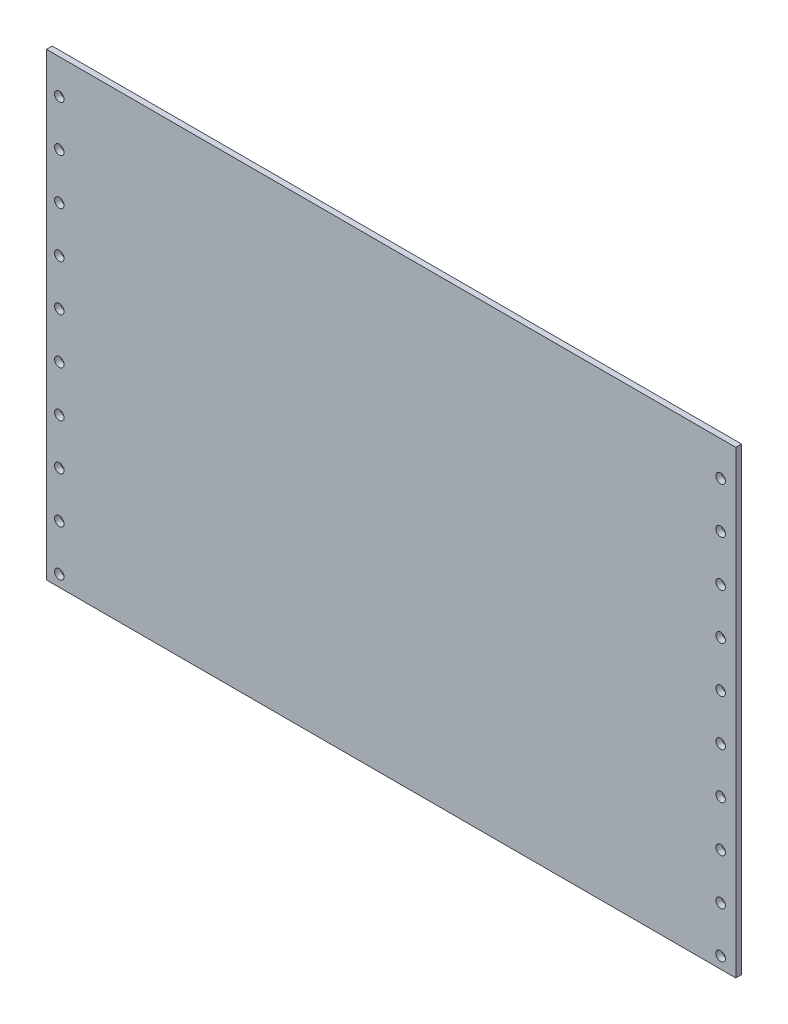
ISO-10303-21;
HEADER;
FILE_DESCRIPTION(('STEP AP214'),'2;1');
FILE_NAME('part.step','',(''),(''),'','','');
FILE_SCHEMA(('AUTOMOTIVE_DESIGN { 1 0 10303 214 1 1 1 1 }'));
ENDSEC;
DATA;
#1=APPLICATION_CONTEXT('core data for automotive mechanical design processes');
#2=APPLICATION_PROTOCOL_DEFINITION('international standard','automotive_design',2000,#1);
#3=PRODUCT_CONTEXT('',#1,'mechanical');
#4=PRODUCT('Part','Part','',(#3));
#5=PRODUCT_RELATED_PRODUCT_CATEGORY('part','',(#4));
#6=PRODUCT_DEFINITION_FORMATION('','',#4);
#7=PRODUCT_DEFINITION_CONTEXT('part definition',#1,'design');
#8=PRODUCT_DEFINITION('design','',#6,#7);
#9=PRODUCT_DEFINITION_SHAPE('','',#8);
#10=(LENGTH_UNIT() NAMED_UNIT(*) SI_UNIT(.MILLI.,.METRE.));
#11=(NAMED_UNIT(*) PLANE_ANGLE_UNIT() SI_UNIT($,.RADIAN.));
#12=(NAMED_UNIT(*) SI_UNIT($,.STERADIAN.) SOLID_ANGLE_UNIT());
#13=UNCERTAINTY_MEASURE_WITH_UNIT(LENGTH_MEASURE(1.E-05),#10,'distance_accuracy_value','');
#14=(GEOMETRIC_REPRESENTATION_CONTEXT(3) GLOBAL_UNCERTAINTY_ASSIGNED_CONTEXT((#13)) GLOBAL_UNIT_ASSIGNED_CONTEXT((#10,
#11,#12)) REPRESENTATION_CONTEXT('',''));
#15=CARTESIAN_POINT('',(0.,0.,0.));
#16=DIRECTION('',(0.,0.,1.));
#17=DIRECTION('',(1.,0.,0.));
#18=AXIS2_PLACEMENT_3D('',#15,#16,#17);
#19=CARTESIAN_POINT('',(0.,0.,3.175));
#20=DIRECTION('',(0.,0.,-1.));
#21=DIRECTION('',(-1.,0.,0.));
#22=AXIS2_PLACEMENT_3D('',#19,#20,#21);
#23=PLANE('',#22);
#24=CARTESIAN_POINT('',(-183.388,107.95,3.175));
#25=DIRECTION('',(0.,0.,1.));
#26=DIRECTION('',(1.,0.,0.));
#27=AXIS2_PLACEMENT_3D('',#24,#25,#26);
#28=CIRCLE('',#27,2.60985);
#29=CARTESIAN_POINT('',(-180.77815,107.95,3.175));
#30=VERTEX_POINT('',#29);
#31=EDGE_CURVE('E232',#30,#30,#28,.T.);
#32=ORIENTED_EDGE('',*,*,#31,.F.);
#33=EDGE_LOOP('',(#32));
#34=FACE_BOUND('',#33,.T.);
#35=CARTESIAN_POINT('',(-183.388,82.55,3.175));
#36=DIRECTION('',(0.,0.,1.));
#37=DIRECTION('',(1.,0.,0.));
#38=AXIS2_PLACEMENT_3D('',#35,#36,#37);
#39=CIRCLE('',#38,2.60985);
#40=CARTESIAN_POINT('',(-180.77815,82.55,3.175));
#41=VERTEX_POINT('',#40);
#42=EDGE_CURVE('E226',#41,#41,#39,.T.);
#43=ORIENTED_EDGE('',*,*,#42,.F.);
#44=EDGE_LOOP('',(#43));
#45=FACE_BOUND('',#44,.T.);
#46=CARTESIAN_POINT('',(-183.387999999999,57.15,3.175));
#47=DIRECTION('',(0.,0.,1.));
#48=DIRECTION('',(1.,0.,0.));
#49=AXIS2_PLACEMENT_3D('',#46,#47,#48);
#50=CIRCLE('',#49,2.60985);
#51=CARTESIAN_POINT('',(-180.778149999999,57.15,3.175));
#52=VERTEX_POINT('',#51);
#53=EDGE_CURVE('E220',#52,#52,#50,.T.);
#54=ORIENTED_EDGE('',*,*,#53,.F.);
#55=EDGE_LOOP('',(#54));
#56=FACE_BOUND('',#55,.T.);
#57=CARTESIAN_POINT('',(-183.387999999999,31.75,3.175));
#58=DIRECTION('',(0.,0.,1.));
#59=DIRECTION('',(1.,0.,0.));
#60=AXIS2_PLACEMENT_3D('',#57,#58,#59);
#61=CIRCLE('',#60,2.60985);
#62=CARTESIAN_POINT('',(-180.778149999999,31.75,3.175));
#63=VERTEX_POINT('',#62);
#64=EDGE_CURVE('E214',#63,#63,#61,.T.);
#65=ORIENTED_EDGE('',*,*,#64,.F.);
#66=EDGE_LOOP('',(#65));
#67=FACE_BOUND('',#66,.T.);
#68=CARTESIAN_POINT('',(-183.387999999999,-19.05,3.175));
#69=DIRECTION('',(0.,0.,1.));
#70=DIRECTION('',(1.,0.,0.));
#71=AXIS2_PLACEMENT_3D('',#68,#69,#70);
#72=CIRCLE('',#71,2.60985);
#73=CARTESIAN_POINT('',(-180.778149999999,-19.05,3.175));
#74=VERTEX_POINT('',#73);
#75=EDGE_CURVE('E202',#74,#74,#72,.T.);
#76=ORIENTED_EDGE('',*,*,#75,.F.);
#77=EDGE_LOOP('',(#76));
#78=FACE_BOUND('',#77,.T.);
#79=CARTESIAN_POINT('',(-183.387999999998,-44.4499999999999,3.175));
#80=DIRECTION('',(0.,0.,1.));
#81=DIRECTION('',(1.,0.,0.));
#82=AXIS2_PLACEMENT_3D('',#79,#80,#81);
#83=CIRCLE('',#82,2.60985);
#84=CARTESIAN_POINT('',(-180.778149999998,-44.4499999999999,3.175));
#85=VERTEX_POINT('',#84);
#86=EDGE_CURVE('E196',#85,#85,#83,.T.);
#87=ORIENTED_EDGE('',*,*,#86,.F.);
#88=EDGE_LOOP('',(#87));
#89=FACE_BOUND('',#88,.T.);
#90=CARTESIAN_POINT('',(-183.387999999998,-69.85,3.175));
#91=DIRECTION('',(0.,0.,1.));
#92=DIRECTION('',(1.,0.,0.));
#93=AXIS2_PLACEMENT_3D('',#90,#91,#92);
#94=CIRCLE('',#93,2.60985);
#95=CARTESIAN_POINT('',(-180.778149999998,-69.85,3.175));
#96=VERTEX_POINT('',#95);
#97=EDGE_CURVE('E190',#96,#96,#94,.T.);
#98=ORIENTED_EDGE('',*,*,#97,.F.);
#99=EDGE_LOOP('',(#98));
#100=FACE_BOUND('',#99,.T.);
#101=CARTESIAN_POINT('',(-183.387999999998,-95.2499999999999,3.175));
#102=DIRECTION('',(0.,0.,1.));
#103=DIRECTION('',(1.,0.,0.));
#104=AXIS2_PLACEMENT_3D('',#101,#102,#103);
#105=CIRCLE('',#104,2.60985);
#106=CARTESIAN_POINT('',(-180.778149999998,-95.2499999999999,3.175));
#107=VERTEX_POINT('',#106);
#108=EDGE_CURVE('E178',#107,#107,#105,.T.);
#109=ORIENTED_EDGE('',*,*,#108,.F.);
#110=EDGE_LOOP('',(#109));
#111=FACE_BOUND('',#110,.T.);
#112=CARTESIAN_POINT('',(182.118000000002,-95.2499999999999,3.175));
#113=DIRECTION('',(0.,0.,1.));
#114=DIRECTION('',(1.,0.,0.));
#115=AXIS2_PLACEMENT_3D('',#112,#113,#114);
#116=CIRCLE('',#115,2.60985);
#117=CARTESIAN_POINT('',(184.727850000002,-95.2499999999999,3.175));
#118=VERTEX_POINT('',#117);
#119=EDGE_CURVE('E166',#118,#118,#116,.T.);
#120=ORIENTED_EDGE('',*,*,#119,.F.);
#121=EDGE_LOOP('',(#120));
#122=FACE_BOUND('',#121,.T.);
#123=CARTESIAN_POINT('',(182.118000000002,-69.85,3.175));
#124=DIRECTION('',(0.,0.,1.));
#125=DIRECTION('',(1.,0.,0.));
#126=AXIS2_PLACEMENT_3D('',#123,#124,#125);
#127=CIRCLE('',#126,2.60985);
#128=CARTESIAN_POINT('',(184.727850000002,-69.85,3.175));
#129=VERTEX_POINT('',#128);
#130=EDGE_CURVE('E160',#129,#129,#127,.T.);
#131=ORIENTED_EDGE('',*,*,#130,.F.);
#132=EDGE_LOOP('',(#131));
#133=FACE_BOUND('',#132,.T.);
#134=CARTESIAN_POINT('',(182.118000000002,-44.4499999999999,3.175));
#135=DIRECTION('',(0.,0.,1.));
#136=DIRECTION('',(1.,0.,0.));
#137=AXIS2_PLACEMENT_3D('',#134,#135,#136);
#138=CIRCLE('',#137,2.60985);
#139=CARTESIAN_POINT('',(184.727850000002,-44.4499999999999,3.175));
#140=VERTEX_POINT('',#139);
#141=EDGE_CURVE('E154',#140,#140,#138,.T.);
#142=ORIENTED_EDGE('',*,*,#141,.F.);
#143=EDGE_LOOP('',(#142));
#144=FACE_BOUND('',#143,.T.);
#145=CARTESIAN_POINT('',(182.118000000001,-19.05,3.175));
#146=DIRECTION('',(0.,0.,1.));
#147=DIRECTION('',(1.,0.,0.));
#148=AXIS2_PLACEMENT_3D('',#145,#146,#147);
#149=CIRCLE('',#148,2.60985);
#150=CARTESIAN_POINT('',(184.727850000001,-19.05,3.175));
#151=VERTEX_POINT('',#150);
#152=EDGE_CURVE('E148',#151,#151,#149,.T.);
#153=ORIENTED_EDGE('',*,*,#152,.F.);
#154=EDGE_LOOP('',(#153));
#155=FACE_BOUND('',#154,.T.);
#156=CARTESIAN_POINT('',(182.118000000001,6.35000000000002,3.175));
#157=DIRECTION('',(0.,0.,1.));
#158=DIRECTION('',(1.,0.,0.));
#159=AXIS2_PLACEMENT_3D('',#156,#157,#158);
#160=CIRCLE('',#159,2.60985);
#161=CARTESIAN_POINT('',(184.727850000001,6.35000000000002,3.175));
#162=VERTEX_POINT('',#161);
#163=EDGE_CURVE('E142',#162,#162,#160,.T.);
#164=ORIENTED_EDGE('',*,*,#163,.F.);
#165=EDGE_LOOP('',(#164));
#166=FACE_BOUND('',#165,.T.);
#167=CARTESIAN_POINT('',(182.118000000001,31.75,3.175));
#168=DIRECTION('',(0.,0.,1.));
#169=DIRECTION('',(1.,0.,0.));
#170=AXIS2_PLACEMENT_3D('',#167,#168,#169);
#171=CIRCLE('',#170,2.60985);
#172=CARTESIAN_POINT('',(184.727850000001,31.75,3.175));
#173=VERTEX_POINT('',#172);
#174=EDGE_CURVE('E136',#173,#173,#171,.T.);
#175=ORIENTED_EDGE('',*,*,#174,.F.);
#176=EDGE_LOOP('',(#175));
#177=FACE_BOUND('',#176,.T.);
#178=CARTESIAN_POINT('',(182.118000000001,57.15,3.175));
#179=DIRECTION('',(0.,0.,1.));
#180=DIRECTION('',(1.,0.,0.));
#181=AXIS2_PLACEMENT_3D('',#178,#179,#180);
#182=CIRCLE('',#181,2.60985);
#183=CARTESIAN_POINT('',(184.727850000001,57.15,3.175));
#184=VERTEX_POINT('',#183);
#185=EDGE_CURVE('E130',#184,#184,#182,.T.);
#186=ORIENTED_EDGE('',*,*,#185,.F.);
#187=EDGE_LOOP('',(#186));
#188=FACE_BOUND('',#187,.T.);
#189=CARTESIAN_POINT('',(182.118,82.55,3.175));
#190=DIRECTION('',(0.,0.,1.));
#191=DIRECTION('',(1.,0.,0.));
#192=AXIS2_PLACEMENT_3D('',#189,#190,#191);
#193=CIRCLE('',#192,2.60985);
#194=CARTESIAN_POINT('',(184.72785,82.55,3.175));
#195=VERTEX_POINT('',#194);
#196=EDGE_CURVE('E124',#195,#195,#193,.T.);
#197=ORIENTED_EDGE('',*,*,#196,.F.);
#198=EDGE_LOOP('',(#197));
#199=FACE_BOUND('',#198,.T.);
#200=CARTESIAN_POINT('',(182.118,107.95,3.175));
#201=DIRECTION('',(0.,0.,1.));
#202=DIRECTION('',(1.,0.,0.));
#203=AXIS2_PLACEMENT_3D('',#200,#201,#202);
#204=CIRCLE('',#203,2.60985);
#205=CARTESIAN_POINT('',(184.72785,107.95,3.175));
#206=VERTEX_POINT('',#205);
#207=EDGE_CURVE('E118',#206,#206,#204,.T.);
#208=ORIENTED_EDGE('',*,*,#207,.F.);
#209=EDGE_LOOP('',(#208));
#210=FACE_BOUND('',#209,.T.);
#211=DIRECTION('',(0.,1.,0.));
#212=VECTOR('',#211,1.);
#213=CARTESIAN_POINT('',(190.5,-127.,3.175));
#214=LINE('',#213,#212);
#215=CARTESIAN_POINT('',(190.5,-127.,3.175));
#216=VERTEX_POINT('',#215);
#217=CARTESIAN_POINT('',(190.5,127.,3.175));
#218=VERTEX_POINT('',#217);
#219=EDGE_CURVE('E89',#216,#218,#214,.T.);
#220=ORIENTED_EDGE('',*,*,#219,.T.);
#221=DIRECTION('',(-1.,0.,0.));
#222=VECTOR('',#221,1.);
#223=CARTESIAN_POINT('',(-190.5,127.,3.175));
#224=LINE('',#223,#222);
#225=CARTESIAN_POINT('',(-190.5,127.,3.175));
#226=VERTEX_POINT('',#225);
#227=EDGE_CURVE('E84',#218,#226,#224,.T.);
#228=ORIENTED_EDGE('',*,*,#227,.T.);
#229=DIRECTION('',(0.,-1.,0.));
#230=VECTOR('',#229,1.);
#231=CARTESIAN_POINT('',(-190.5,-127.,3.175));
#232=LINE('',#231,#230);
#233=CARTESIAN_POINT('',(-190.5,-127.,3.175));
#234=VERTEX_POINT('',#233);
#235=EDGE_CURVE('E87',#226,#234,#232,.T.);
#236=ORIENTED_EDGE('',*,*,#235,.T.);
#237=DIRECTION('',(1.,0.,0.));
#238=VECTOR('',#237,1.);
#239=CARTESIAN_POINT('',(-190.5,-127.,3.175));
#240=LINE('',#239,#238);
#241=EDGE_CURVE('E54',#234,#216,#240,.T.);
#242=ORIENTED_EDGE('',*,*,#241,.T.);
#243=EDGE_LOOP('',(#220,#228,#236,#242));
#244=FACE_BOUND('',#243,.T.);
#245=CARTESIAN_POINT('',(182.118000000002,-120.65,3.175));
#246=DIRECTION('',(0.,0.,1.));
#247=DIRECTION('',(1.,0.,0.));
#248=AXIS2_PLACEMENT_3D('',#245,#246,#247);
#249=CIRCLE('',#248,2.60985);
#250=CARTESIAN_POINT('',(184.727850000002,-120.65,3.175));
#251=VERTEX_POINT('',#250);
#252=EDGE_CURVE('E172',#251,#251,#249,.T.);
#253=ORIENTED_EDGE('',*,*,#252,.F.);
#254=EDGE_LOOP('',(#253));
#255=FACE_BOUND('',#254,.T.);
#256=CARTESIAN_POINT('',(-183.387999999998,-120.65,3.175));
#257=DIRECTION('',(0.,0.,1.));
#258=DIRECTION('',(1.,0.,0.));
#259=AXIS2_PLACEMENT_3D('',#256,#257,#258);
#260=CIRCLE('',#259,2.60985);
#261=CARTESIAN_POINT('',(-180.778149999998,-120.65,3.175));
#262=VERTEX_POINT('',#261);
#263=EDGE_CURVE('E184',#262,#262,#260,.T.);
#264=ORIENTED_EDGE('',*,*,#263,.F.);
#265=EDGE_LOOP('',(#264));
#266=FACE_BOUND('',#265,.T.);
#267=CARTESIAN_POINT('',(-183.387999999999,6.35000000000002,3.175));
#268=DIRECTION('',(0.,0.,1.));
#269=DIRECTION('',(1.,0.,0.));
#270=AXIS2_PLACEMENT_3D('',#267,#268,#269);
#271=CIRCLE('',#270,2.60985);
#272=CARTESIAN_POINT('',(-180.778149999999,6.35000000000002,3.175));
#273=VERTEX_POINT('',#272);
#274=EDGE_CURVE('E208',#273,#273,#271,.T.);
#275=ORIENTED_EDGE('',*,*,#274,.F.);
#276=EDGE_LOOP('',(#275));
#277=FACE_BOUND('',#276,.T.);
#278=ADVANCED_FACE('F37',(#34,#45,#56,#67,#78,#89,#100,#111,#122,#133,#144,#155,#166,#177,#188,
#199,#210,#244,#255,#266,#277),#23,.F.);
#279=CARTESIAN_POINT('',(0.,0.,0.));
#280=DIRECTION('',(0.,0.,-1.));
#281=DIRECTION('',(-1.,0.,0.));
#282=AXIS2_PLACEMENT_3D('',#279,#280,#281);
#283=PLANE('',#282);
#284=CARTESIAN_POINT('',(-183.388,107.95,0.));
#285=DIRECTION('',(0.,0.,1.));
#286=DIRECTION('',(1.,0.,0.));
#287=AXIS2_PLACEMENT_3D('',#284,#285,#286);
#288=CIRCLE('',#287,2.60985);
#289=CARTESIAN_POINT('',(-180.77815,107.95,0.));
#290=VERTEX_POINT('',#289);
#291=EDGE_CURVE('E229',#290,#290,#288,.T.);
#292=ORIENTED_EDGE('',*,*,#291,.T.);
#293=EDGE_LOOP('',(#292));
#294=FACE_BOUND('',#293,.T.);
#295=CARTESIAN_POINT('',(-183.388,82.55,0.));
#296=DIRECTION('',(0.,0.,1.));
#297=DIRECTION('',(1.,0.,0.));
#298=AXIS2_PLACEMENT_3D('',#295,#296,#297);
#299=CIRCLE('',#298,2.60985);
#300=CARTESIAN_POINT('',(-180.77815,82.55,0.));
#301=VERTEX_POINT('',#300);
#302=EDGE_CURVE('E223',#301,#301,#299,.T.);
#303=ORIENTED_EDGE('',*,*,#302,.T.);
#304=EDGE_LOOP('',(#303));
#305=FACE_BOUND('',#304,.T.);
#306=CARTESIAN_POINT('',(-183.387999999999,57.15,0.));
#307=DIRECTION('',(0.,0.,1.));
#308=DIRECTION('',(1.,0.,0.));
#309=AXIS2_PLACEMENT_3D('',#306,#307,#308);
#310=CIRCLE('',#309,2.60985);
#311=CARTESIAN_POINT('',(-180.778149999999,57.15,0.));
#312=VERTEX_POINT('',#311);
#313=EDGE_CURVE('E217',#312,#312,#310,.T.);
#314=ORIENTED_EDGE('',*,*,#313,.T.);
#315=EDGE_LOOP('',(#314));
#316=FACE_BOUND('',#315,.T.);
#317=CARTESIAN_POINT('',(-183.387999999999,31.75,0.));
#318=DIRECTION('',(0.,0.,1.));
#319=DIRECTION('',(1.,0.,0.));
#320=AXIS2_PLACEMENT_3D('',#317,#318,#319);
#321=CIRCLE('',#320,2.60985);
#322=CARTESIAN_POINT('',(-180.778149999999,31.75,0.));
#323=VERTEX_POINT('',#322);
#324=EDGE_CURVE('E211',#323,#323,#321,.T.);
#325=ORIENTED_EDGE('',*,*,#324,.T.);
#326=EDGE_LOOP('',(#325));
#327=FACE_BOUND('',#326,.T.);
#328=CARTESIAN_POINT('',(-183.387999999999,6.35000000000002,0.));
#329=DIRECTION('',(0.,0.,1.));
#330=DIRECTION('',(1.,0.,0.));
#331=AXIS2_PLACEMENT_3D('',#328,#329,#330);
#332=CIRCLE('',#331,2.60985);
#333=CARTESIAN_POINT('',(-180.778149999999,6.35000000000002,0.));
#334=VERTEX_POINT('',#333);
#335=EDGE_CURVE('E205',#334,#334,#332,.T.);
#336=ORIENTED_EDGE('',*,*,#335,.T.);
#337=EDGE_LOOP('',(#336));
#338=FACE_BOUND('',#337,.T.);
#339=CARTESIAN_POINT('',(-183.387999999999,-19.05,0.));
#340=DIRECTION('',(0.,0.,1.));
#341=DIRECTION('',(1.,0.,0.));
#342=AXIS2_PLACEMENT_3D('',#339,#340,#341);
#343=CIRCLE('',#342,2.60985);
#344=CARTESIAN_POINT('',(-180.778149999999,-19.05,0.));
#345=VERTEX_POINT('',#344);
#346=EDGE_CURVE('E199',#345,#345,#343,.T.);
#347=ORIENTED_EDGE('',*,*,#346,.T.);
#348=EDGE_LOOP('',(#347));
#349=FACE_BOUND('',#348,.T.);
#350=CARTESIAN_POINT('',(-183.387999999998,-69.85,0.));
#351=DIRECTION('',(0.,0.,1.));
#352=DIRECTION('',(1.,0.,0.));
#353=AXIS2_PLACEMENT_3D('',#350,#351,#352);
#354=CIRCLE('',#353,2.60985);
#355=CARTESIAN_POINT('',(-180.778149999998,-69.85,0.));
#356=VERTEX_POINT('',#355);
#357=EDGE_CURVE('E187',#356,#356,#354,.T.);
#358=ORIENTED_EDGE('',*,*,#357,.T.);
#359=EDGE_LOOP('',(#358));
#360=FACE_BOUND('',#359,.T.);
#361=CARTESIAN_POINT('',(-183.387999999998,-120.65,0.));
#362=DIRECTION('',(0.,0.,1.));
#363=DIRECTION('',(1.,0.,0.));
#364=AXIS2_PLACEMENT_3D('',#361,#362,#363);
#365=CIRCLE('',#364,2.60985);
#366=CARTESIAN_POINT('',(-180.778149999998,-120.65,0.));
#367=VERTEX_POINT('',#366);
#368=EDGE_CURVE('E181',#367,#367,#365,.T.);
#369=ORIENTED_EDGE('',*,*,#368,.T.);
#370=EDGE_LOOP('',(#369));
#371=FACE_BOUND('',#370,.T.);
#372=CARTESIAN_POINT('',(-183.387999999998,-95.2499999999999,0.));
#373=DIRECTION('',(0.,0.,1.));
#374=DIRECTION('',(1.,0.,0.));
#375=AXIS2_PLACEMENT_3D('',#372,#373,#374);
#376=CIRCLE('',#375,2.60985);
#377=CARTESIAN_POINT('',(-180.778149999998,-95.2499999999999,0.));
#378=VERTEX_POINT('',#377);
#379=EDGE_CURVE('E175',#378,#378,#376,.T.);
#380=ORIENTED_EDGE('',*,*,#379,.T.);
#381=EDGE_LOOP('',(#380));
#382=FACE_BOUND('',#381,.T.);
#383=CARTESIAN_POINT('',(182.118000000002,-120.65,0.));
#384=DIRECTION('',(0.,0.,1.));
#385=DIRECTION('',(1.,0.,0.));
#386=AXIS2_PLACEMENT_3D('',#383,#384,#385);
#387=CIRCLE('',#386,2.60985);
#388=CARTESIAN_POINT('',(184.727850000002,-120.65,0.));
#389=VERTEX_POINT('',#388);
#390=EDGE_CURVE('E169',#389,#389,#387,.T.);
#391=ORIENTED_EDGE('',*,*,#390,.T.);
#392=EDGE_LOOP('',(#391));
#393=FACE_BOUND('',#392,.T.);
#394=CARTESIAN_POINT('',(182.118000000002,-95.2499999999999,0.));
#395=DIRECTION('',(0.,0.,1.));
#396=DIRECTION('',(1.,0.,0.));
#397=AXIS2_PLACEMENT_3D('',#394,#395,#396);
#398=CIRCLE('',#397,2.60985);
#399=CARTESIAN_POINT('',(184.727850000002,-95.2499999999999,0.));
#400=VERTEX_POINT('',#399);
#401=EDGE_CURVE('E163',#400,#400,#398,.T.);
#402=ORIENTED_EDGE('',*,*,#401,.T.);
#403=EDGE_LOOP('',(#402));
#404=FACE_BOUND('',#403,.T.);
#405=CARTESIAN_POINT('',(182.118000000002,-69.85,0.));
#406=DIRECTION('',(0.,0.,1.));
#407=DIRECTION('',(1.,0.,0.));
#408=AXIS2_PLACEMENT_3D('',#405,#406,#407);
#409=CIRCLE('',#408,2.60985);
#410=CARTESIAN_POINT('',(184.727850000002,-69.85,0.));
#411=VERTEX_POINT('',#410);
#412=EDGE_CURVE('E157',#411,#411,#409,.T.);
#413=ORIENTED_EDGE('',*,*,#412,.T.);
#414=EDGE_LOOP('',(#413));
#415=FACE_BOUND('',#414,.T.);
#416=CARTESIAN_POINT('',(182.118000000002,-44.4499999999999,0.));
#417=DIRECTION('',(0.,0.,1.));
#418=DIRECTION('',(1.,0.,0.));
#419=AXIS2_PLACEMENT_3D('',#416,#417,#418);
#420=CIRCLE('',#419,2.60985);
#421=CARTESIAN_POINT('',(184.727850000002,-44.4499999999999,0.));
#422=VERTEX_POINT('',#421);
#423=EDGE_CURVE('E151',#422,#422,#420,.T.);
#424=ORIENTED_EDGE('',*,*,#423,.T.);
#425=EDGE_LOOP('',(#424));
#426=FACE_BOUND('',#425,.T.);
#427=CARTESIAN_POINT('',(182.118000000001,-19.05,0.));
#428=DIRECTION('',(0.,0.,1.));
#429=DIRECTION('',(1.,0.,0.));
#430=AXIS2_PLACEMENT_3D('',#427,#428,#429);
#431=CIRCLE('',#430,2.60985);
#432=CARTESIAN_POINT('',(184.727850000001,-19.05,0.));
#433=VERTEX_POINT('',#432);
#434=EDGE_CURVE('E145',#433,#433,#431,.T.);
#435=ORIENTED_EDGE('',*,*,#434,.T.);
#436=EDGE_LOOP('',(#435));
#437=FACE_BOUND('',#436,.T.);
#438=CARTESIAN_POINT('',(182.118000000001,6.35000000000002,0.));
#439=DIRECTION('',(0.,0.,1.));
#440=DIRECTION('',(1.,0.,0.));
#441=AXIS2_PLACEMENT_3D('',#438,#439,#440);
#442=CIRCLE('',#441,2.60985);
#443=CARTESIAN_POINT('',(184.727850000001,6.35000000000002,0.));
#444=VERTEX_POINT('',#443);
#445=EDGE_CURVE('E139',#444,#444,#442,.T.);
#446=ORIENTED_EDGE('',*,*,#445,.T.);
#447=EDGE_LOOP('',(#446));
#448=FACE_BOUND('',#447,.T.);
#449=CARTESIAN_POINT('',(182.118000000001,31.75,0.));
#450=DIRECTION('',(0.,0.,1.));
#451=DIRECTION('',(1.,0.,0.));
#452=AXIS2_PLACEMENT_3D('',#449,#450,#451);
#453=CIRCLE('',#452,2.60985);
#454=CARTESIAN_POINT('',(184.727850000001,31.75,0.));
#455=VERTEX_POINT('',#454);
#456=EDGE_CURVE('E133',#455,#455,#453,.T.);
#457=ORIENTED_EDGE('',*,*,#456,.T.);
#458=EDGE_LOOP('',(#457));
#459=FACE_BOUND('',#458,.T.);
#460=DIRECTION('',(0.,1.,0.));
#461=VECTOR('',#460,1.);
#462=CARTESIAN_POINT('',(190.5,-127.,0.));
#463=LINE('',#462,#461);
#464=CARTESIAN_POINT('',(190.5,-127.,0.));
#465=VERTEX_POINT('',#464);
#466=CARTESIAN_POINT('',(190.5,127.,0.));
#467=VERTEX_POINT('',#466);
#468=EDGE_CURVE('E101',#465,#467,#463,.T.);
#469=ORIENTED_EDGE('',*,*,#468,.F.);
#470=DIRECTION('',(1.,0.,0.));
#471=VECTOR('',#470,1.);
#472=CARTESIAN_POINT('',(-190.5,-127.,0.));
#473=LINE('',#472,#471);
#474=CARTESIAN_POINT('',(-190.5,-127.,0.));
#475=VERTEX_POINT('',#474);
#476=EDGE_CURVE('E77',#475,#465,#473,.T.);
#477=ORIENTED_EDGE('',*,*,#476,.F.);
#478=DIRECTION('',(0.,-1.,0.));
#479=VECTOR('',#478,1.);
#480=CARTESIAN_POINT('',(-190.5,-127.,0.));
#481=LINE('',#480,#479);
#482=CARTESIAN_POINT('',(-190.5,127.,0.));
#483=VERTEX_POINT('',#482);
#484=EDGE_CURVE('E71',#483,#475,#481,.T.);
#485=ORIENTED_EDGE('',*,*,#484,.F.);
#486=DIRECTION('',(-1.,0.,0.));
#487=VECTOR('',#486,1.);
#488=CARTESIAN_POINT('',(-190.5,127.,0.));
#489=LINE('',#488,#487);
#490=EDGE_CURVE('E93',#467,#483,#489,.T.);
#491=ORIENTED_EDGE('',*,*,#490,.F.);
#492=EDGE_LOOP('',(#469,#477,#485,#491));
#493=FACE_BOUND('',#492,.T.);
#494=CARTESIAN_POINT('',(182.118,107.95,0.));
#495=DIRECTION('',(0.,0.,1.));
#496=DIRECTION('',(1.,0.,0.));
#497=AXIS2_PLACEMENT_3D('',#494,#495,#496);
#498=CIRCLE('',#497,2.60985);
#499=CARTESIAN_POINT('',(184.72785,107.95,0.));
#500=VERTEX_POINT('',#499);
#501=EDGE_CURVE('E104',#500,#500,#498,.T.);
#502=ORIENTED_EDGE('',*,*,#501,.T.);
#503=EDGE_LOOP('',(#502));
#504=FACE_BOUND('',#503,.T.);
#505=CARTESIAN_POINT('',(182.118,82.55,0.));
#506=DIRECTION('',(0.,0.,1.));
#507=DIRECTION('',(1.,0.,0.));
#508=AXIS2_PLACEMENT_3D('',#505,#506,#507);
#509=CIRCLE('',#508,2.60985);
#510=CARTESIAN_POINT('',(184.72785,82.55,0.));
#511=VERTEX_POINT('',#510);
#512=EDGE_CURVE('E121',#511,#511,#509,.T.);
#513=ORIENTED_EDGE('',*,*,#512,.T.);
#514=EDGE_LOOP('',(#513));
#515=FACE_BOUND('',#514,.T.);
#516=CARTESIAN_POINT('',(182.118000000001,57.15,0.));
#517=DIRECTION('',(0.,0.,1.));
#518=DIRECTION('',(1.,0.,0.));
#519=AXIS2_PLACEMENT_3D('',#516,#517,#518);
#520=CIRCLE('',#519,2.60985);
#521=CARTESIAN_POINT('',(184.727850000001,57.15,0.));
#522=VERTEX_POINT('',#521);
#523=EDGE_CURVE('E127',#522,#522,#520,.T.);
#524=ORIENTED_EDGE('',*,*,#523,.T.);
#525=EDGE_LOOP('',(#524));
#526=FACE_BOUND('',#525,.T.);
#527=CARTESIAN_POINT('',(-183.387999999998,-44.4499999999999,0.));
#528=DIRECTION('',(0.,0.,1.));
#529=DIRECTION('',(1.,0.,0.));
#530=AXIS2_PLACEMENT_3D('',#527,#528,#529);
#531=CIRCLE('',#530,2.60985);
#532=CARTESIAN_POINT('',(-180.778149999998,-44.4499999999999,0.));
#533=VERTEX_POINT('',#532);
#534=EDGE_CURVE('E193',#533,#533,#531,.T.);
#535=ORIENTED_EDGE('',*,*,#534,.T.);
#536=EDGE_LOOP('',(#535));
#537=FACE_BOUND('',#536,.T.);
#538=ADVANCED_FACE('F112',(#294,#305,#316,#327,#338,#349,#360,#371,#382,#393,#404,#415,#426,
#437,#448,#459,#493,#504,#515,#526,#537),#283,.T.);
#539=CARTESIAN_POINT('',(190.5,-127.,3.175));
#540=DIRECTION('',(-1.,0.,0.));
#541=DIRECTION('',(0.,0.,1.));
#542=AXIS2_PLACEMENT_3D('',#539,#540,#541);
#543=PLANE('',#542);
#544=ORIENTED_EDGE('',*,*,#468,.T.);
#545=DIRECTION('',(0.,0.,-1.));
#546=VECTOR('',#545,1.);
#547=CARTESIAN_POINT('',(190.5,127.,3.175));
#548=LINE('',#547,#546);
#549=EDGE_CURVE('E11',#218,#467,#548,.T.);
#550=ORIENTED_EDGE('',*,*,#549,.F.);
#551=ORIENTED_EDGE('',*,*,#219,.F.);
#552=DIRECTION('',(0.,0.,-1.));
#553=VECTOR('',#552,1.);
#554=CARTESIAN_POINT('',(190.5,-127.,3.175));
#555=LINE('',#554,#553);
#556=EDGE_CURVE('E97',#216,#465,#555,.T.);
#557=ORIENTED_EDGE('',*,*,#556,.T.);
#558=EDGE_LOOP('',(#544,#550,#551,#557));
#559=FACE_BOUND('',#558,.T.);
#560=ADVANCED_FACE('F39',(#559),#543,.F.);
#561=CARTESIAN_POINT('',(-190.5,127.,3.175));
#562=DIRECTION('',(0.,-1.,0.));
#563=DIRECTION('',(0.,0.,-1.));
#564=AXIS2_PLACEMENT_3D('',#561,#562,#563);
#565=PLANE('',#564);
#566=ORIENTED_EDGE('',*,*,#490,.T.);
#567=DIRECTION('',(0.,0.,-1.));
#568=VECTOR('',#567,1.);
#569=CARTESIAN_POINT('',(-190.5,127.,3.175));
#570=LINE('',#569,#568);
#571=EDGE_CURVE('E46',#226,#483,#570,.T.);
#572=ORIENTED_EDGE('',*,*,#571,.F.);
#573=ORIENTED_EDGE('',*,*,#227,.F.);
#574=ORIENTED_EDGE('',*,*,#549,.T.);
#575=EDGE_LOOP('',(#566,#572,#573,#574));
#576=FACE_BOUND('',#575,.T.);
#577=ADVANCED_FACE('F92',(#576),#565,.F.);
#578=CARTESIAN_POINT('',(-190.5,-127.,3.175));
#579=DIRECTION('',(1.,0.,0.));
#580=DIRECTION('',(0.,0.,-1.));
#581=AXIS2_PLACEMENT_3D('',#578,#579,#580);
#582=PLANE('',#581);
#583=ORIENTED_EDGE('',*,*,#484,.T.);
#584=DIRECTION('',(0.,0.,-1.));
#585=VECTOR('',#584,1.);
#586=CARTESIAN_POINT('',(-190.5,-127.,3.175));
#587=LINE('',#586,#585);
#588=EDGE_CURVE('E94',#234,#475,#587,.T.);
#589=ORIENTED_EDGE('',*,*,#588,.F.);
#590=ORIENTED_EDGE('',*,*,#235,.F.);
#591=ORIENTED_EDGE('',*,*,#571,.T.);
#592=EDGE_LOOP('',(#583,#589,#590,#591));
#593=FACE_BOUND('',#592,.T.);
#594=ADVANCED_FACE('F95',(#593),#582,.F.);
#595=CARTESIAN_POINT('',(-190.5,-127.,3.175));
#596=DIRECTION('',(0.,1.,0.));
#597=DIRECTION('',(0.,0.,1.));
#598=AXIS2_PLACEMENT_3D('',#595,#596,#597);
#599=PLANE('',#598);
#600=ORIENTED_EDGE('',*,*,#476,.T.);
#601=ORIENTED_EDGE('',*,*,#556,.F.);
#602=ORIENTED_EDGE('',*,*,#241,.F.);
#603=ORIENTED_EDGE('',*,*,#588,.T.);
#604=EDGE_LOOP('',(#600,#601,#602,#603));
#605=FACE_BOUND('',#604,.T.);
#606=ADVANCED_FACE('F109',(#605),#599,.F.);
#607=CARTESIAN_POINT('',(182.118,107.95,3.175));
#608=DIRECTION('',(0.,0.,1.));
#609=DIRECTION('',(1.,0.,0.));
#610=AXIS2_PLACEMENT_3D('',#607,#608,#609);
#611=CYLINDRICAL_SURFACE('',#610,2.60985);
#612=ORIENTED_EDGE('',*,*,#501,.F.);
#613=EDGE_LOOP('',(#612));
#614=FACE_BOUND('',#613,.T.);
#615=ORIENTED_EDGE('',*,*,#207,.T.);
#616=EDGE_LOOP('',(#615));
#617=FACE_BOUND('',#616,.T.);
#618=ADVANCED_FACE('F273',(#614,#617),#611,.F.);
#619=CARTESIAN_POINT('',(182.118,82.55,3.175));
#620=DIRECTION('',(0.,0.,1.));
#621=DIRECTION('',(1.,0.,0.));
#622=AXIS2_PLACEMENT_3D('',#619,#620,#621);
#623=CYLINDRICAL_SURFACE('',#622,2.60985);
#624=ORIENTED_EDGE('',*,*,#512,.F.);
#625=EDGE_LOOP('',(#624));
#626=FACE_BOUND('',#625,.T.);
#627=ORIENTED_EDGE('',*,*,#196,.T.);
#628=EDGE_LOOP('',(#627));
#629=FACE_BOUND('',#628,.T.);
#630=ADVANCED_FACE('F275',(#626,#629),#623,.F.);
#631=CARTESIAN_POINT('',(182.118000000001,57.15,3.175));
#632=DIRECTION('',(0.,0.,1.));
#633=DIRECTION('',(1.,0.,0.));
#634=AXIS2_PLACEMENT_3D('',#631,#632,#633);
#635=CYLINDRICAL_SURFACE('',#634,2.60985);
#636=ORIENTED_EDGE('',*,*,#523,.F.);
#637=EDGE_LOOP('',(#636));
#638=FACE_BOUND('',#637,.T.);
#639=ORIENTED_EDGE('',*,*,#185,.T.);
#640=EDGE_LOOP('',(#639));
#641=FACE_BOUND('',#640,.T.);
#642=ADVANCED_FACE('F282',(#638,#641),#635,.F.);
#643=CARTESIAN_POINT('',(182.118000000001,31.75,3.175));
#644=DIRECTION('',(0.,0.,1.));
#645=DIRECTION('',(1.,0.,0.));
#646=AXIS2_PLACEMENT_3D('',#643,#644,#645);
#647=CYLINDRICAL_SURFACE('',#646,2.60985);
#648=ORIENTED_EDGE('',*,*,#456,.F.);
#649=EDGE_LOOP('',(#648));
#650=FACE_BOUND('',#649,.T.);
#651=ORIENTED_EDGE('',*,*,#174,.T.);
#652=EDGE_LOOP('',(#651));
#653=FACE_BOUND('',#652,.T.);
#654=ADVANCED_FACE('F363',(#650,#653),#647,.F.);
#655=CARTESIAN_POINT('',(182.118000000001,6.35000000000002,3.175));
#656=DIRECTION('',(0.,0.,1.));
#657=DIRECTION('',(1.,0.,0.));
#658=AXIS2_PLACEMENT_3D('',#655,#656,#657);
#659=CYLINDRICAL_SURFACE('',#658,2.60985);
#660=ORIENTED_EDGE('',*,*,#445,.F.);
#661=EDGE_LOOP('',(#660));
#662=FACE_BOUND('',#661,.T.);
#663=ORIENTED_EDGE('',*,*,#163,.T.);
#664=EDGE_LOOP('',(#663));
#665=FACE_BOUND('',#664,.T.);
#666=ADVANCED_FACE('F373',(#662,#665),#659,.F.);
#667=CARTESIAN_POINT('',(182.118000000001,-19.05,3.175));
#668=DIRECTION('',(0.,0.,1.));
#669=DIRECTION('',(1.,0.,0.));
#670=AXIS2_PLACEMENT_3D('',#667,#668,#669);
#671=CYLINDRICAL_SURFACE('',#670,2.60985);
#672=ORIENTED_EDGE('',*,*,#434,.F.);
#673=EDGE_LOOP('',(#672));
#674=FACE_BOUND('',#673,.T.);
#675=ORIENTED_EDGE('',*,*,#152,.T.);
#676=EDGE_LOOP('',(#675));
#677=FACE_BOUND('',#676,.T.);
#678=ADVANCED_FACE('F384',(#674,#677),#671,.F.);
#679=CARTESIAN_POINT('',(182.118000000002,-44.4499999999999,3.175));
#680=DIRECTION('',(0.,0.,1.));
#681=DIRECTION('',(1.,0.,0.));
#682=AXIS2_PLACEMENT_3D('',#679,#680,#681);
#683=CYLINDRICAL_SURFACE('',#682,2.60985);
#684=ORIENTED_EDGE('',*,*,#423,.F.);
#685=EDGE_LOOP('',(#684));
#686=FACE_BOUND('',#685,.T.);
#687=ORIENTED_EDGE('',*,*,#141,.T.);
#688=EDGE_LOOP('',(#687));
#689=FACE_BOUND('',#688,.T.);
#690=ADVANCED_FACE('F395',(#686,#689),#683,.F.);
#691=CARTESIAN_POINT('',(182.118000000002,-69.85,3.175));
#692=DIRECTION('',(0.,0.,1.));
#693=DIRECTION('',(1.,0.,0.));
#694=AXIS2_PLACEMENT_3D('',#691,#692,#693);
#695=CYLINDRICAL_SURFACE('',#694,2.60985);
#696=ORIENTED_EDGE('',*,*,#412,.F.);
#697=EDGE_LOOP('',(#696));
#698=FACE_BOUND('',#697,.T.);
#699=ORIENTED_EDGE('',*,*,#130,.T.);
#700=EDGE_LOOP('',(#699));
#701=FACE_BOUND('',#700,.T.);
#702=ADVANCED_FACE('F406',(#698,#701),#695,.F.);
#703=CARTESIAN_POINT('',(182.118000000002,-95.2499999999999,3.175));
#704=DIRECTION('',(0.,0.,1.));
#705=DIRECTION('',(1.,0.,0.));
#706=AXIS2_PLACEMENT_3D('',#703,#704,#705);
#707=CYLINDRICAL_SURFACE('',#706,2.60985);
#708=ORIENTED_EDGE('',*,*,#401,.F.);
#709=EDGE_LOOP('',(#708));
#710=FACE_BOUND('',#709,.T.);
#711=ORIENTED_EDGE('',*,*,#119,.T.);
#712=EDGE_LOOP('',(#711));
#713=FACE_BOUND('',#712,.T.);
#714=ADVANCED_FACE('F417',(#710,#713),#707,.F.);
#715=CARTESIAN_POINT('',(182.118000000002,-120.65,3.175));
#716=DIRECTION('',(0.,0.,1.));
#717=DIRECTION('',(1.,0.,0.));
#718=AXIS2_PLACEMENT_3D('',#715,#716,#717);
#719=CYLINDRICAL_SURFACE('',#718,2.60985);
#720=ORIENTED_EDGE('',*,*,#390,.F.);
#721=EDGE_LOOP('',(#720));
#722=FACE_BOUND('',#721,.T.);
#723=ORIENTED_EDGE('',*,*,#252,.T.);
#724=EDGE_LOOP('',(#723));
#725=FACE_BOUND('',#724,.T.);
#726=ADVANCED_FACE('F428',(#722,#725),#719,.F.);
#727=CARTESIAN_POINT('',(-183.387999999998,-95.2499999999999,3.175));
#728=DIRECTION('',(0.,0.,1.));
#729=DIRECTION('',(1.,0.,0.));
#730=AXIS2_PLACEMENT_3D('',#727,#728,#729);
#731=CYLINDRICAL_SURFACE('',#730,2.60985);
#732=ORIENTED_EDGE('',*,*,#379,.F.);
#733=EDGE_LOOP('',(#732));
#734=FACE_BOUND('',#733,.T.);
#735=ORIENTED_EDGE('',*,*,#108,.T.);
#736=EDGE_LOOP('',(#735));
#737=FACE_BOUND('',#736,.T.);
#738=ADVANCED_FACE('F439',(#734,#737),#731,.F.);
#739=CARTESIAN_POINT('',(-183.387999999998,-120.65,3.175));
#740=DIRECTION('',(0.,0.,1.));
#741=DIRECTION('',(1.,0.,0.));
#742=AXIS2_PLACEMENT_3D('',#739,#740,#741);
#743=CYLINDRICAL_SURFACE('',#742,2.60985);
#744=ORIENTED_EDGE('',*,*,#368,.F.);
#745=EDGE_LOOP('',(#744));
#746=FACE_BOUND('',#745,.T.);
#747=ORIENTED_EDGE('',*,*,#263,.T.);
#748=EDGE_LOOP('',(#747));
#749=FACE_BOUND('',#748,.T.);
#750=ADVANCED_FACE('F450',(#746,#749),#743,.F.);
#751=CARTESIAN_POINT('',(-183.387999999998,-69.85,3.175));
#752=DIRECTION('',(0.,0.,1.));
#753=DIRECTION('',(1.,0.,0.));
#754=AXIS2_PLACEMENT_3D('',#751,#752,#753);
#755=CYLINDRICAL_SURFACE('',#754,2.60985);
#756=ORIENTED_EDGE('',*,*,#357,.F.);
#757=EDGE_LOOP('',(#756));
#758=FACE_BOUND('',#757,.T.);
#759=ORIENTED_EDGE('',*,*,#97,.T.);
#760=EDGE_LOOP('',(#759));
#761=FACE_BOUND('',#760,.T.);
#762=ADVANCED_FACE('F461',(#758,#761),#755,.F.);
#763=CARTESIAN_POINT('',(-183.387999999998,-44.4499999999999,3.175));
#764=DIRECTION('',(0.,0.,1.));
#765=DIRECTION('',(1.,0.,0.));
#766=AXIS2_PLACEMENT_3D('',#763,#764,#765);
#767=CYLINDRICAL_SURFACE('',#766,2.60985);
#768=ORIENTED_EDGE('',*,*,#534,.F.);
#769=EDGE_LOOP('',(#768));
#770=FACE_BOUND('',#769,.T.);
#771=ORIENTED_EDGE('',*,*,#86,.T.);
#772=EDGE_LOOP('',(#771));
#773=FACE_BOUND('',#772,.T.);
#774=ADVANCED_FACE('F472',(#770,#773),#767,.F.);
#775=CARTESIAN_POINT('',(-183.387999999999,-19.05,3.175));
#776=DIRECTION('',(0.,0.,1.));
#777=DIRECTION('',(1.,0.,0.));
#778=AXIS2_PLACEMENT_3D('',#775,#776,#777);
#779=CYLINDRICAL_SURFACE('',#778,2.60985);
#780=ORIENTED_EDGE('',*,*,#346,.F.);
#781=EDGE_LOOP('',(#780));
#782=FACE_BOUND('',#781,.T.);
#783=ORIENTED_EDGE('',*,*,#75,.T.);
#784=EDGE_LOOP('',(#783));
#785=FACE_BOUND('',#784,.T.);
#786=ADVANCED_FACE('F483',(#782,#785),#779,.F.);
#787=CARTESIAN_POINT('',(-183.387999999999,6.35000000000002,3.175));
#788=DIRECTION('',(0.,0.,1.));
#789=DIRECTION('',(1.,0.,0.));
#790=AXIS2_PLACEMENT_3D('',#787,#788,#789);
#791=CYLINDRICAL_SURFACE('',#790,2.60985);
#792=ORIENTED_EDGE('',*,*,#335,.F.);
#793=EDGE_LOOP('',(#792));
#794=FACE_BOUND('',#793,.T.);
#795=ORIENTED_EDGE('',*,*,#274,.T.);
#796=EDGE_LOOP('',(#795));
#797=FACE_BOUND('',#796,.T.);
#798=ADVANCED_FACE('F494',(#794,#797),#791,.F.);
#799=CARTESIAN_POINT('',(-183.387999999999,31.75,3.175));
#800=DIRECTION('',(0.,0.,1.));
#801=DIRECTION('',(1.,0.,0.));
#802=AXIS2_PLACEMENT_3D('',#799,#800,#801);
#803=CYLINDRICAL_SURFACE('',#802,2.60985);
#804=ORIENTED_EDGE('',*,*,#324,.F.);
#805=EDGE_LOOP('',(#804));
#806=FACE_BOUND('',#805,.T.);
#807=ORIENTED_EDGE('',*,*,#64,.T.);
#808=EDGE_LOOP('',(#807));
#809=FACE_BOUND('',#808,.T.);
#810=ADVANCED_FACE('F505',(#806,#809),#803,.F.);
#811=CARTESIAN_POINT('',(-183.387999999999,57.15,3.175));
#812=DIRECTION('',(0.,0.,1.));
#813=DIRECTION('',(1.,0.,0.));
#814=AXIS2_PLACEMENT_3D('',#811,#812,#813);
#815=CYLINDRICAL_SURFACE('',#814,2.60985);
#816=ORIENTED_EDGE('',*,*,#313,.F.);
#817=EDGE_LOOP('',(#816));
#818=FACE_BOUND('',#817,.T.);
#819=ORIENTED_EDGE('',*,*,#53,.T.);
#820=EDGE_LOOP('',(#819));
#821=FACE_BOUND('',#820,.T.);
#822=ADVANCED_FACE('F516',(#818,#821),#815,.F.);
#823=CARTESIAN_POINT('',(-183.388,82.55,3.175));
#824=DIRECTION('',(0.,0.,1.));
#825=DIRECTION('',(1.,0.,0.));
#826=AXIS2_PLACEMENT_3D('',#823,#824,#825);
#827=CYLINDRICAL_SURFACE('',#826,2.60985);
#828=ORIENTED_EDGE('',*,*,#302,.F.);
#829=EDGE_LOOP('',(#828));
#830=FACE_BOUND('',#829,.T.);
#831=ORIENTED_EDGE('',*,*,#42,.T.);
#832=EDGE_LOOP('',(#831));
#833=FACE_BOUND('',#832,.T.);
#834=ADVANCED_FACE('F527',(#830,#833),#827,.F.);
#835=CARTESIAN_POINT('',(-183.388,107.95,3.175));
#836=DIRECTION('',(0.,0.,1.));
#837=DIRECTION('',(1.,0.,0.));
#838=AXIS2_PLACEMENT_3D('',#835,#836,#837);
#839=CYLINDRICAL_SURFACE('',#838,2.60985);
#840=ORIENTED_EDGE('',*,*,#291,.F.);
#841=EDGE_LOOP('',(#840));
#842=FACE_BOUND('',#841,.T.);
#843=ORIENTED_EDGE('',*,*,#31,.T.);
#844=EDGE_LOOP('',(#843));
#845=FACE_BOUND('',#844,.T.);
#846=ADVANCED_FACE('F236',(#842,#845),#839,.F.);
#847=CLOSED_SHELL('',(#278,#538,#560,#577,#594,#606,#618,#630,#642,#654,#666,#678,#690,#702,
#714,#726,#738,#750,#762,#774,#786,#798,#810,#822,#834,#846));
#848=MANIFOLD_SOLID_BREP('B2',#847);
#849=ADVANCED_BREP_SHAPE_REPRESENTATION('',(#18,#848),#14);
#850=SHAPE_DEFINITION_REPRESENTATION(#9,#849);
ENDSEC;
END-ISO-10303-21;
